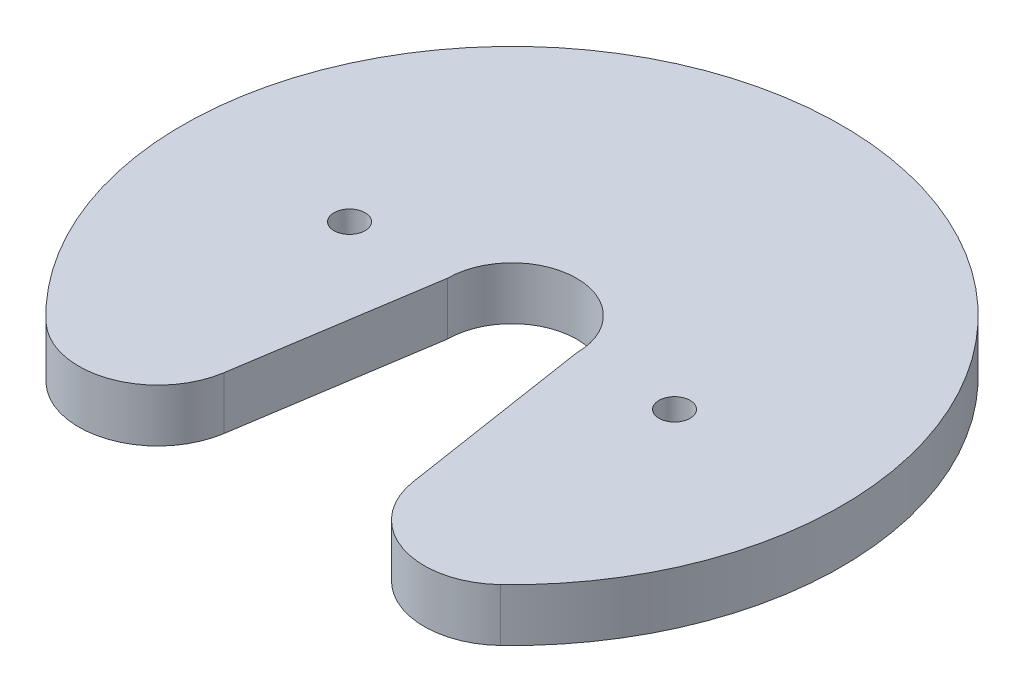
ISO-10303-21;
HEADER;
FILE_DESCRIPTION(('STEP AP214'),'2;1');
FILE_NAME('part.step','',(''),(''),'','','');
FILE_SCHEMA(('AUTOMOTIVE_DESIGN { 1 0 10303 214 1 1 1 1 }'));
ENDSEC;
DATA;
#1=APPLICATION_CONTEXT('core data for automotive mechanical design processes');
#2=APPLICATION_PROTOCOL_DEFINITION('international standard','automotive_design',2000,#1);
#3=PRODUCT_CONTEXT('',#1,'mechanical');
#4=PRODUCT('Part','Part','',(#3));
#5=PRODUCT_RELATED_PRODUCT_CATEGORY('part','',(#4));
#6=PRODUCT_DEFINITION_FORMATION('','',#4);
#7=PRODUCT_DEFINITION_CONTEXT('part definition',#1,'design');
#8=PRODUCT_DEFINITION('design','',#6,#7);
#9=PRODUCT_DEFINITION_SHAPE('','',#8);
#10=(LENGTH_UNIT() NAMED_UNIT(*) SI_UNIT(.MILLI.,.METRE.));
#11=(NAMED_UNIT(*) PLANE_ANGLE_UNIT() SI_UNIT($,.RADIAN.));
#12=(NAMED_UNIT(*) SI_UNIT($,.STERADIAN.) SOLID_ANGLE_UNIT());
#13=UNCERTAINTY_MEASURE_WITH_UNIT(LENGTH_MEASURE(1.E-05),#10,'distance_accuracy_value','');
#14=(GEOMETRIC_REPRESENTATION_CONTEXT(3) GLOBAL_UNCERTAINTY_ASSIGNED_CONTEXT((#13)) GLOBAL_UNIT_ASSIGNED_CONTEXT((#10,
#11,#12)) REPRESENTATION_CONTEXT('',''));
#15=CARTESIAN_POINT('',(0.,0.,0.));
#16=DIRECTION('',(0.,0.,1.));
#17=DIRECTION('',(1.,0.,0.));
#18=AXIS2_PLACEMENT_3D('',#15,#16,#17);
#19=CARTESIAN_POINT('',(16.6369938105831,5.08,17.4776238930417));
#20=DIRECTION('',(0.,1.,0.));
#21=DIRECTION('',(0.,0.,1.));
#22=AXIS2_PLACEMENT_3D('',#19,#20,#21);
#23=PLANE('',#22);
#24=CARTESIAN_POINT('',(15.6509721800262,5.08,0.));
#25=DIRECTION('',(0.,1.,0.));
#26=DIRECTION('',(0.,0.,1.));
#27=AXIS2_PLACEMENT_3D('',#24,#25,#26);
#28=CIRCLE('',#27,1.5);
#29=CARTESIAN_POINT('',(15.6509721800262,5.08,1.5));
#30=VERTEX_POINT('',#29);
#31=EDGE_CURVE('E122',#30,#30,#28,.T.);
#32=ORIENTED_EDGE('',*,*,#31,.F.);
#33=EDGE_LOOP('',(#32));
#34=FACE_BOUND('',#33,.T.);
#35=CARTESIAN_POINT('',(16.6369938105831,5.08,17.4776238930417));
#36=DIRECTION('',(0.,1.,0.));
#37=DIRECTION('',(0.,0.,1.));
#38=AXIS2_PLACEMENT_3D('',#35,#36,#37);
#39=CIRCLE('',#38,7.62);
#40=CARTESIAN_POINT('',(9.1065437724038,5.08,18.6424080887131));
#41=VERTEX_POINT('',#40);
#42=CARTESIAN_POINT('',(21.8907813297146,5.08,22.9968735434759));
#43=VERTEX_POINT('',#42);
#44=EDGE_CURVE('E129',#41,#43,#39,.T.);
#45=ORIENTED_EDGE('',*,*,#44,.T.);
#46=CARTESIAN_POINT('',(0.,5.08,0.));
#47=DIRECTION('',(0.,1.,0.));
#48=DIRECTION('',(0.,0.,1.));
#49=AXIS2_PLACEMENT_3D('',#46,#47,#48);
#50=CIRCLE('',#49,31.75);
#51=CARTESIAN_POINT('',(-21.8907813297146,5.08,22.9968735434759));
#52=VERTEX_POINT('',#51);
#53=EDGE_CURVE('E87',#43,#52,#50,.T.);
#54=ORIENTED_EDGE('',*,*,#53,.T.);
#55=CARTESIAN_POINT('',(-16.6369938105831,5.08,17.4776238930417));
#56=DIRECTION('',(0.,1.,0.));
#57=DIRECTION('',(0.,0.,-1.));
#58=AXIS2_PLACEMENT_3D('',#55,#56,#57);
#59=CIRCLE('',#58,7.62);
#60=CARTESIAN_POINT('',(-9.1065437724038,5.08,18.6424080887131));
#61=VERTEX_POINT('',#60);
#62=EDGE_CURVE('E100',#52,#61,#59,.T.);
#63=ORIENTED_EDGE('',*,*,#62,.T.);
#64=DIRECTION('',(0.152858818329581,0.,-0.988248036506465));
#65=VECTOR('',#64,1.);
#66=CARTESIAN_POINT('',(-6.223,5.08,0.));
#67=LINE('',#66,#65);
#68=CARTESIAN_POINT('',(-6.223,5.08,0.));
#69=VERTEX_POINT('',#68);
#70=EDGE_CURVE('E94',#61,#69,#67,.T.);
#71=ORIENTED_EDGE('',*,*,#70,.T.);
#72=CARTESIAN_POINT('',(0.,5.08,0.));
#73=DIRECTION('',(0.,-1.,0.));
#74=DIRECTION('',(0.,0.,1.));
#75=AXIS2_PLACEMENT_3D('',#72,#73,#74);
#76=CIRCLE('',#75,6.223);
#77=CARTESIAN_POINT('',(6.223,5.08,0.));
#78=VERTEX_POINT('',#77);
#79=EDGE_CURVE('E98',#69,#78,#76,.T.);
#80=ORIENTED_EDGE('',*,*,#79,.T.);
#81=DIRECTION('',(0.152858818329581,0.,0.988248036506465));
#82=VECTOR('',#81,1.);
#83=CARTESIAN_POINT('',(6.223,5.08,0.));
#84=LINE('',#83,#82);
#85=EDGE_CURVE('E50',#78,#41,#84,.T.);
#86=ORIENTED_EDGE('',*,*,#85,.T.);
#87=EDGE_LOOP('',(#45,#54,#63,#71,#80,#86));
#88=FACE_BOUND('',#87,.T.);
#89=CARTESIAN_POINT('',(-15.6509721800262,5.08,0.));
#90=DIRECTION('',(0.,1.,0.));
#91=DIRECTION('',(0.,0.,-1.));
#92=AXIS2_PLACEMENT_3D('',#89,#90,#91);
#93=CIRCLE('',#92,1.5);
#94=CARTESIAN_POINT('',(-15.6509721800262,5.08,-1.5));
#95=VERTEX_POINT('',#94);
#96=EDGE_CURVE('E172',#95,#95,#93,.T.);
#97=ORIENTED_EDGE('',*,*,#96,.F.);
#98=EDGE_LOOP('',(#97));
#99=FACE_BOUND('',#98,.T.);
#100=ADVANCED_FACE('F33',(#34,#88,#99),#23,.T.);
#101=CARTESIAN_POINT('',(16.6369938105831,0.,17.4776238930417));
#102=DIRECTION('',(0.,1.,0.));
#103=DIRECTION('',(0.,0.,1.));
#104=AXIS2_PLACEMENT_3D('',#101,#102,#103);
#105=PLANE('',#104);
#106=CARTESIAN_POINT('',(15.6509721800262,0.,0.));
#107=DIRECTION('',(0.,1.,0.));
#108=DIRECTION('',(0.,0.,1.));
#109=AXIS2_PLACEMENT_3D('',#106,#107,#108);
#110=CIRCLE('',#109,1.5);
#111=CARTESIAN_POINT('',(15.6509721800262,0.,1.5));
#112=VERTEX_POINT('',#111);
#113=EDGE_CURVE('E177',#112,#112,#110,.T.);
#114=ORIENTED_EDGE('',*,*,#113,.T.);
#115=EDGE_LOOP('',(#114));
#116=FACE_BOUND('',#115,.T.);
#117=CARTESIAN_POINT('',(16.6369938105831,0.,17.4776238930417));
#118=DIRECTION('',(0.,1.,0.));
#119=DIRECTION('',(0.,0.,1.));
#120=AXIS2_PLACEMENT_3D('',#117,#118,#119);
#121=CIRCLE('',#120,7.62);
#122=CARTESIAN_POINT('',(9.1065437724038,0.,18.6424080887131));
#123=VERTEX_POINT('',#122);
#124=CARTESIAN_POINT('',(21.8907813297146,0.,22.9968735434759));
#125=VERTEX_POINT('',#124);
#126=EDGE_CURVE('E118',#123,#125,#121,.T.);
#127=ORIENTED_EDGE('',*,*,#126,.F.);
#128=DIRECTION('',(0.152858818329581,0.,0.988248036506465));
#129=VECTOR('',#128,1.);
#130=CARTESIAN_POINT('',(6.223,0.,0.));
#131=LINE('',#130,#129);
#132=CARTESIAN_POINT('',(6.223,0.,0.));
#133=VERTEX_POINT('',#132);
#134=EDGE_CURVE('E79',#133,#123,#131,.T.);
#135=ORIENTED_EDGE('',*,*,#134,.F.);
#136=CARTESIAN_POINT('',(0.,0.,0.));
#137=DIRECTION('',(0.,-1.,0.));
#138=DIRECTION('',(0.,0.,1.));
#139=AXIS2_PLACEMENT_3D('',#136,#137,#138);
#140=CIRCLE('',#139,6.223);
#141=CARTESIAN_POINT('',(-6.223,0.,0.));
#142=VERTEX_POINT('',#141);
#143=EDGE_CURVE('E73',#142,#133,#140,.T.);
#144=ORIENTED_EDGE('',*,*,#143,.F.);
#145=DIRECTION('',(0.152858818329581,0.,-0.988248036506465));
#146=VECTOR('',#145,1.);
#147=CARTESIAN_POINT('',(-6.223,0.,0.));
#148=LINE('',#147,#146);
#149=CARTESIAN_POINT('',(-9.1065437724038,0.,18.6424080887131));
#150=VERTEX_POINT('',#149);
#151=EDGE_CURVE('E108',#150,#142,#148,.T.);
#152=ORIENTED_EDGE('',*,*,#151,.F.);
#153=CARTESIAN_POINT('',(-16.6369938105831,0.,17.4776238930417));
#154=DIRECTION('',(0.,1.,0.));
#155=DIRECTION('',(0.,0.,-1.));
#156=AXIS2_PLACEMENT_3D('',#153,#154,#155);
#157=CIRCLE('',#156,7.62);
#158=CARTESIAN_POINT('',(-21.8907813297146,0.,22.9968735434759));
#159=VERTEX_POINT('',#158);
#160=EDGE_CURVE('E124',#159,#150,#157,.T.);
#161=ORIENTED_EDGE('',*,*,#160,.F.);
#162=CARTESIAN_POINT('',(0.,0.,0.));
#163=DIRECTION('',(0.,1.,0.));
#164=DIRECTION('',(0.,0.,1.));
#165=AXIS2_PLACEMENT_3D('',#162,#163,#164);
#166=CIRCLE('',#165,31.75);
#167=EDGE_CURVE('E121',#125,#159,#166,.T.);
#168=ORIENTED_EDGE('',*,*,#167,.F.);
#169=EDGE_LOOP('',(#127,#135,#144,#152,#161,#168));
#170=FACE_BOUND('',#169,.T.);
#171=CARTESIAN_POINT('',(-15.6509721800262,0.,0.));
#172=DIRECTION('',(0.,1.,0.));
#173=DIRECTION('',(0.,0.,-1.));
#174=AXIS2_PLACEMENT_3D('',#171,#172,#173);
#175=CIRCLE('',#174,1.5);
#176=CARTESIAN_POINT('',(-15.6509721800262,0.,-1.5));
#177=VERTEX_POINT('',#176);
#178=EDGE_CURVE('E175',#177,#177,#175,.T.);
#179=ORIENTED_EDGE('',*,*,#178,.T.);
#180=EDGE_LOOP('',(#179));
#181=FACE_BOUND('',#180,.T.);
#182=ADVANCED_FACE('F138',(#116,#170,#181),#105,.F.);
#183=CARTESIAN_POINT('',(16.6369938105831,5.08,17.4776238930417));
#184=DIRECTION('',(0.,-1.,0.));
#185=DIRECTION('',(0.,0.,-1.));
#186=AXIS2_PLACEMENT_3D('',#183,#184,#185);
#187=CYLINDRICAL_SURFACE('',#186,7.62);
#188=ORIENTED_EDGE('',*,*,#126,.T.);
#189=DIRECTION('',(0.,-1.,0.));
#190=VECTOR('',#189,1.);
#191=CARTESIAN_POINT('',(21.8907813297146,5.08,22.9968735434759));
#192=LINE('',#191,#190);
#193=EDGE_CURVE('E11',#43,#125,#192,.T.);
#194=ORIENTED_EDGE('',*,*,#193,.F.);
#195=ORIENTED_EDGE('',*,*,#44,.F.);
#196=DIRECTION('',(0.,-1.,0.));
#197=VECTOR('',#196,1.);
#198=CARTESIAN_POINT('',(9.1065437724038,5.08,18.6424080887131));
#199=LINE('',#198,#197);
#200=EDGE_CURVE('E114',#41,#123,#199,.T.);
#201=ORIENTED_EDGE('',*,*,#200,.T.);
#202=EDGE_LOOP('',(#188,#194,#195,#201));
#203=FACE_BOUND('',#202,.T.);
#204=ADVANCED_FACE('F35',(#203),#187,.T.);
#205=CARTESIAN_POINT('',(0.,5.08,0.));
#206=DIRECTION('',(0.,-1.,0.));
#207=DIRECTION('',(0.,0.,-1.));
#208=AXIS2_PLACEMENT_3D('',#205,#206,#207);
#209=CYLINDRICAL_SURFACE('',#208,31.75);
#210=ORIENTED_EDGE('',*,*,#167,.T.);
#211=DIRECTION('',(0.,-1.,0.));
#212=VECTOR('',#211,1.);
#213=CARTESIAN_POINT('',(-21.8907813297146,5.08,22.9968735434759));
#214=LINE('',#213,#212);
#215=EDGE_CURVE('E42',#52,#159,#214,.T.);
#216=ORIENTED_EDGE('',*,*,#215,.F.);
#217=ORIENTED_EDGE('',*,*,#53,.F.);
#218=ORIENTED_EDGE('',*,*,#193,.T.);
#219=EDGE_LOOP('',(#210,#216,#217,#218));
#220=FACE_BOUND('',#219,.T.);
#221=ADVANCED_FACE('F218',(#220),#209,.T.);
#222=CARTESIAN_POINT('',(-16.6369938105831,5.08,17.4776238930417));
#223=DIRECTION('',(0.,-1.,0.));
#224=DIRECTION('',(0.,0.,-1.));
#225=AXIS2_PLACEMENT_3D('',#222,#223,#224);
#226=CYLINDRICAL_SURFACE('',#225,7.62);
#227=ORIENTED_EDGE('',*,*,#160,.T.);
#228=DIRECTION('',(0.,-1.,0.));
#229=VECTOR('',#228,1.);
#230=CARTESIAN_POINT('',(-9.1065437724038,5.08,18.6424080887131));
#231=LINE('',#230,#229);
#232=EDGE_CURVE('E109',#61,#150,#231,.T.);
#233=ORIENTED_EDGE('',*,*,#232,.F.);
#234=ORIENTED_EDGE('',*,*,#62,.F.);
#235=ORIENTED_EDGE('',*,*,#215,.T.);
#236=EDGE_LOOP('',(#227,#233,#234,#235));
#237=FACE_BOUND('',#236,.T.);
#238=ADVANCED_FACE('F135',(#237),#226,.T.);
#239=CARTESIAN_POINT('',(-6.223,5.08,0.));
#240=DIRECTION('',(-0.988248036506466,0.,-0.152858818329581));
#241=DIRECTION('',(-0.152858818329581,0.,0.988248036506466));
#242=AXIS2_PLACEMENT_3D('',#239,#240,#241);
#243=PLANE('',#242);
#244=ORIENTED_EDGE('',*,*,#151,.T.);
#245=DIRECTION('',(0.,-1.,0.));
#246=VECTOR('',#245,1.);
#247=CARTESIAN_POINT('',(-6.223,5.08,0.));
#248=LINE('',#247,#246);
#249=EDGE_CURVE('E105',#69,#142,#248,.T.);
#250=ORIENTED_EDGE('',*,*,#249,.F.);
#251=ORIENTED_EDGE('',*,*,#70,.F.);
#252=ORIENTED_EDGE('',*,*,#232,.T.);
#253=EDGE_LOOP('',(#244,#250,#251,#252));
#254=FACE_BOUND('',#253,.T.);
#255=ADVANCED_FACE('F106',(#254),#243,.F.);
#256=CARTESIAN_POINT('',(0.,5.08,0.));
#257=DIRECTION('',(0.,-1.,0.));
#258=DIRECTION('',(0.,0.,-1.));
#259=AXIS2_PLACEMENT_3D('',#256,#257,#258);
#260=CYLINDRICAL_SURFACE('',#259,6.223);
#261=ORIENTED_EDGE('',*,*,#143,.T.);
#262=DIRECTION('',(0.,-1.,0.));
#263=VECTOR('',#262,1.);
#264=CARTESIAN_POINT('',(6.223,5.08,0.));
#265=LINE('',#264,#263);
#266=EDGE_CURVE('E110',#78,#133,#265,.T.);
#267=ORIENTED_EDGE('',*,*,#266,.F.);
#268=ORIENTED_EDGE('',*,*,#79,.F.);
#269=ORIENTED_EDGE('',*,*,#249,.T.);
#270=EDGE_LOOP('',(#261,#267,#268,#269));
#271=FACE_BOUND('',#270,.T.);
#272=ADVANCED_FACE('F112',(#271),#260,.F.);
#273=CARTESIAN_POINT('',(6.223,5.08,0.));
#274=DIRECTION('',(0.988248036506466,0.,-0.152858818329581));
#275=DIRECTION('',(-0.152858818329581,0.,-0.988248036506466));
#276=AXIS2_PLACEMENT_3D('',#273,#274,#275);
#277=PLANE('',#276);
#278=ORIENTED_EDGE('',*,*,#134,.T.);
#279=ORIENTED_EDGE('',*,*,#200,.F.);
#280=ORIENTED_EDGE('',*,*,#85,.F.);
#281=ORIENTED_EDGE('',*,*,#266,.T.);
#282=EDGE_LOOP('',(#278,#279,#280,#281));
#283=FACE_BOUND('',#282,.T.);
#284=ADVANCED_FACE('F143',(#283),#277,.F.);
#285=CARTESIAN_POINT('',(15.6509721800262,5.08,0.));
#286=DIRECTION('',(0.,-1.,0.));
#287=DIRECTION('',(0.,0.,-1.));
#288=AXIS2_PLACEMENT_3D('',#285,#286,#287);
#289=CYLINDRICAL_SURFACE('',#288,1.5);
#290=ORIENTED_EDGE('',*,*,#31,.T.);
#291=EDGE_LOOP('',(#290));
#292=FACE_BOUND('',#291,.T.);
#293=ORIENTED_EDGE('',*,*,#113,.F.);
#294=EDGE_LOOP('',(#293));
#295=FACE_BOUND('',#294,.T.);
#296=ADVANCED_FACE('F145',(#292,#295),#289,.F.);
#297=CARTESIAN_POINT('',(-15.6509721800262,5.08,0.));
#298=DIRECTION('',(0.,-1.,0.));
#299=DIRECTION('',(0.,0.,-1.));
#300=AXIS2_PLACEMENT_3D('',#297,#298,#299);
#301=CYLINDRICAL_SURFACE('',#300,1.5);
#302=ORIENTED_EDGE('',*,*,#96,.T.);
#303=EDGE_LOOP('',(#302));
#304=FACE_BOUND('',#303,.T.);
#305=ORIENTED_EDGE('',*,*,#178,.F.);
#306=EDGE_LOOP('',(#305));
#307=FACE_BOUND('',#306,.T.);
#308=ADVANCED_FACE('F151',(#304,#307),#301,.F.);
#309=CLOSED_SHELL('',(#100,#182,#204,#221,#238,#255,#272,#284,#296,#308));
#310=MANIFOLD_SOLID_BREP('B2',#309);
#311=ADVANCED_BREP_SHAPE_REPRESENTATION('',(#18,#310),#14);
#312=SHAPE_DEFINITION_REPRESENTATION(#9,#311);
ENDSEC;
END-ISO-10303-21;
